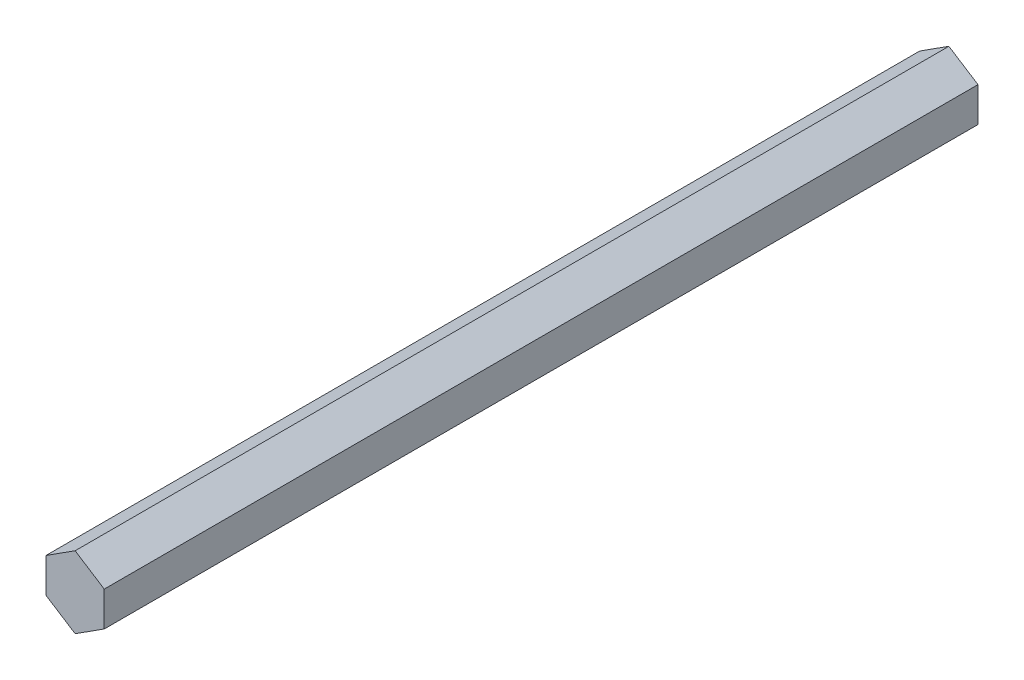
ISO-10303-21;
HEADER;
FILE_DESCRIPTION(('STEP AP214'),'2;1');
FILE_NAME('part.step','',(''),(''),'','','');
FILE_SCHEMA(('AUTOMOTIVE_DESIGN { 1 0 10303 214 1 1 1 1 }'));
ENDSEC;
DATA;
#1=APPLICATION_CONTEXT('core data for automotive mechanical design processes');
#2=APPLICATION_PROTOCOL_DEFINITION('international standard','automotive_design',2000,#1);
#3=PRODUCT_CONTEXT('',#1,'mechanical');
#4=PRODUCT('Part','Part','',(#3));
#5=PRODUCT_RELATED_PRODUCT_CATEGORY('part','',(#4));
#6=PRODUCT_DEFINITION_FORMATION('','',#4);
#7=PRODUCT_DEFINITION_CONTEXT('part definition',#1,'design');
#8=PRODUCT_DEFINITION('design','',#6,#7);
#9=PRODUCT_DEFINITION_SHAPE('','',#8);
#10=(LENGTH_UNIT() NAMED_UNIT(*) SI_UNIT(.MILLI.,.METRE.));
#11=(NAMED_UNIT(*) PLANE_ANGLE_UNIT() SI_UNIT($,.RADIAN.));
#12=(NAMED_UNIT(*) SI_UNIT($,.STERADIAN.) SOLID_ANGLE_UNIT());
#13=UNCERTAINTY_MEASURE_WITH_UNIT(LENGTH_MEASURE(1.E-05),#10,'distance_accuracy_value','');
#14=(GEOMETRIC_REPRESENTATION_CONTEXT(3) GLOBAL_UNCERTAINTY_ASSIGNED_CONTEXT((#13)) GLOBAL_UNIT_ASSIGNED_CONTEXT((#10,
#11,#12)) REPRESENTATION_CONTEXT('',''));
#15=CARTESIAN_POINT('',(0.,0.,0.));
#16=DIRECTION('',(0.,0.,1.));
#17=DIRECTION('',(1.,0.,0.));
#18=AXIS2_PLACEMENT_3D('',#15,#16,#17);
#19=CARTESIAN_POINT('',(-3.81,-2.43750099055179,114.3));
#20=DIRECTION('',(-0.538912681448957,0.842361633607262,0.));
#21=DIRECTION('',(-0.842361633607262,-0.538912681448957,0.));
#22=AXIS2_PLACEMENT_3D('',#19,#20,#21);
#23=PLANE('',#22);
#24=DIRECTION('',(0.842361633607262,0.538912681448957,0.));
#25=VECTOR('',#24,1.);
#26=CARTESIAN_POINT('',(-3.81,-2.43750099055179,0.));
#27=LINE('',#26,#25);
#28=CARTESIAN_POINT('',(-3.81,-2.43750099055179,0.));
#29=VERTEX_POINT('',#28);
#30=CARTESIAN_POINT('',(0.,0.,0.));
#31=VERTEX_POINT('',#30);
#32=EDGE_CURVE('E134',#29,#31,#27,.T.);
#33=ORIENTED_EDGE('',*,*,#32,.T.);
#34=DIRECTION('',(0.,0.,-1.));
#35=VECTOR('',#34,1.);
#36=CARTESIAN_POINT('',(0.,0.,114.3));
#37=LINE('',#36,#35);
#38=CARTESIAN_POINT('',(0.,0.,114.3));
#39=VERTEX_POINT('',#38);
#40=EDGE_CURVE('E11',#39,#31,#37,.T.);
#41=ORIENTED_EDGE('',*,*,#40,.F.);
#42=DIRECTION('',(0.842361633607262,0.538912681448957,0.));
#43=VECTOR('',#42,1.);
#44=CARTESIAN_POINT('',(-3.81,-2.43750099055179,114.3));
#45=LINE('',#44,#43);
#46=CARTESIAN_POINT('',(-3.81,-2.43750099055179,114.3));
#47=VERTEX_POINT('',#46);
#48=EDGE_CURVE('E150',#47,#39,#45,.T.);
#49=ORIENTED_EDGE('',*,*,#48,.F.);
#50=DIRECTION('',(0.,0.,-1.));
#51=VECTOR('',#50,1.);
#52=CARTESIAN_POINT('',(-3.81,-2.43750099055179,114.3));
#53=LINE('',#52,#51);
#54=EDGE_CURVE('E130',#47,#29,#53,.T.);
#55=ORIENTED_EDGE('',*,*,#54,.T.);
#56=EDGE_LOOP('',(#33,#41,#49,#55));
#57=FACE_BOUND('',#56,.T.);
#58=ADVANCED_FACE('F45',(#57),#23,.F.);
#59=CARTESIAN_POINT('',(0.,0.,114.3));
#60=DIRECTION('',(-1.,0.,0.));
#61=DIRECTION('',(0.,0.,1.));
#62=AXIS2_PLACEMENT_3D('',#59,#60,#61);
#63=PLANE('',#62);
#64=DIRECTION('',(0.,1.,0.));
#65=VECTOR('',#64,1.);
#66=CARTESIAN_POINT('',(0.,0.,0.));
#67=LINE('',#66,#65);
#68=CARTESIAN_POINT('',(0.,4.52299801889642,0.));
#69=VERTEX_POINT('',#68);
#70=EDGE_CURVE('E138',#31,#69,#67,.T.);
#71=ORIENTED_EDGE('',*,*,#70,.T.);
#72=DIRECTION('',(0.,0.,-1.));
#73=VECTOR('',#72,1.);
#74=CARTESIAN_POINT('',(0.,4.52299801889642,114.3));
#75=LINE('',#74,#73);
#76=CARTESIAN_POINT('',(0.,4.52299801889642,114.3));
#77=VERTEX_POINT('',#76);
#78=EDGE_CURVE('E54',#77,#69,#75,.T.);
#79=ORIENTED_EDGE('',*,*,#78,.F.);
#80=DIRECTION('',(0.,1.,0.));
#81=VECTOR('',#80,1.);
#82=CARTESIAN_POINT('',(0.,0.,114.3));
#83=LINE('',#82,#81);
#84=EDGE_CURVE('E99',#39,#77,#83,.T.);
#85=ORIENTED_EDGE('',*,*,#84,.F.);
#86=ORIENTED_EDGE('',*,*,#40,.T.);
#87=EDGE_LOOP('',(#71,#79,#85,#86));
#88=FACE_BOUND('',#87,.T.);
#89=ADVANCED_FACE('F178',(#88),#63,.F.);
#90=CARTESIAN_POINT('',(0.,4.52299801889642,114.3));
#91=DIRECTION('',(-0.538912681448957,-0.842361633607262,0.));
#92=DIRECTION('',(0.842361633607262,-0.538912681448957,0.));
#93=AXIS2_PLACEMENT_3D('',#90,#91,#92);
#94=PLANE('',#93);
#95=DIRECTION('',(-0.842361633607262,0.538912681448957,0.));
#96=VECTOR('',#95,1.);
#97=CARTESIAN_POINT('',(0.,4.52299801889642,0.));
#98=LINE('',#97,#96);
#99=CARTESIAN_POINT('',(-3.81,6.96049900944821,0.));
#100=VERTEX_POINT('',#99);
#101=EDGE_CURVE('E141',#69,#100,#98,.T.);
#102=ORIENTED_EDGE('',*,*,#101,.T.);
#103=DIRECTION('',(0.,0.,-1.));
#104=VECTOR('',#103,1.);
#105=CARTESIAN_POINT('',(-3.81,6.96049900944821,114.3));
#106=LINE('',#105,#104);
#107=CARTESIAN_POINT('',(-3.81,6.96049900944821,114.3));
#108=VERTEX_POINT('',#107);
#109=EDGE_CURVE('E123',#108,#100,#106,.T.);
#110=ORIENTED_EDGE('',*,*,#109,.F.);
#111=DIRECTION('',(-0.842361633607262,0.538912681448957,0.));
#112=VECTOR('',#111,1.);
#113=CARTESIAN_POINT('',(0.,4.52299801889642,114.3));
#114=LINE('',#113,#112);
#115=EDGE_CURVE('E112',#77,#108,#114,.T.);
#116=ORIENTED_EDGE('',*,*,#115,.F.);
#117=ORIENTED_EDGE('',*,*,#78,.T.);
#118=EDGE_LOOP('',(#102,#110,#116,#117));
#119=FACE_BOUND('',#118,.T.);
#120=ADVANCED_FACE('F160',(#119),#94,.F.);
#121=CARTESIAN_POINT('',(-3.81,6.96049900944821,114.3));
#122=DIRECTION('',(0.538912681448957,-0.842361633607262,0.));
#123=DIRECTION('',(0.842361633607262,0.538912681448957,0.));
#124=AXIS2_PLACEMENT_3D('',#121,#122,#123);
#125=PLANE('',#124);
#126=DIRECTION('',(-0.842361633607262,-0.538912681448957,0.));
#127=VECTOR('',#126,1.);
#128=CARTESIAN_POINT('',(-3.81,6.96049900944821,0.));
#129=LINE('',#128,#127);
#130=CARTESIAN_POINT('',(-7.62,4.52299801889642,0.));
#131=VERTEX_POINT('',#130);
#132=EDGE_CURVE('E121',#100,#131,#129,.T.);
#133=ORIENTED_EDGE('',*,*,#132,.T.);
#134=DIRECTION('',(0.,0.,-1.));
#135=VECTOR('',#134,1.);
#136=CARTESIAN_POINT('',(-7.62,4.52299801889642,114.3));
#137=LINE('',#136,#135);
#138=CARTESIAN_POINT('',(-7.62,4.52299801889642,114.3));
#139=VERTEX_POINT('',#138);
#140=EDGE_CURVE('E118',#139,#131,#137,.T.);
#141=ORIENTED_EDGE('',*,*,#140,.F.);
#142=DIRECTION('',(-0.842361633607262,-0.538912681448957,0.));
#143=VECTOR('',#142,1.);
#144=CARTESIAN_POINT('',(-3.81,6.96049900944821,114.3));
#145=LINE('',#144,#143);
#146=EDGE_CURVE('E106',#108,#139,#145,.T.);
#147=ORIENTED_EDGE('',*,*,#146,.F.);
#148=ORIENTED_EDGE('',*,*,#109,.T.);
#149=EDGE_LOOP('',(#133,#141,#147,#148));
#150=FACE_BOUND('',#149,.T.);
#151=ADVANCED_FACE('F119',(#150),#125,.F.);
#152=CARTESIAN_POINT('',(-7.62,4.52299801889642,114.3));
#153=DIRECTION('',(1.,0.,0.));
#154=DIRECTION('',(0.,1.,0.));
#155=AXIS2_PLACEMENT_3D('',#152,#153,#154);
#156=PLANE('',#155);
#157=DIRECTION('',(0.,-1.,0.));
#158=VECTOR('',#157,1.);
#159=CARTESIAN_POINT('',(-7.62,4.52299801889642,0.));
#160=LINE('',#159,#158);
#161=CARTESIAN_POINT('',(-7.62,0.,0.));
#162=VERTEX_POINT('',#161);
#163=EDGE_CURVE('E85',#131,#162,#160,.T.);
#164=ORIENTED_EDGE('',*,*,#163,.T.);
#165=DIRECTION('',(0.,0.,-1.));
#166=VECTOR('',#165,1.);
#167=CARTESIAN_POINT('',(-7.62,0.,114.3));
#168=LINE('',#167,#166);
#169=CARTESIAN_POINT('',(-7.62,0.,114.3));
#170=VERTEX_POINT('',#169);
#171=EDGE_CURVE('E124',#170,#162,#168,.T.);
#172=ORIENTED_EDGE('',*,*,#171,.F.);
#173=DIRECTION('',(0.,-1.,0.));
#174=VECTOR('',#173,1.);
#175=CARTESIAN_POINT('',(-7.62,4.52299801889642,114.3));
#176=LINE('',#175,#174);
#177=EDGE_CURVE('E110',#139,#170,#176,.T.);
#178=ORIENTED_EDGE('',*,*,#177,.F.);
#179=ORIENTED_EDGE('',*,*,#140,.T.);
#180=EDGE_LOOP('',(#164,#172,#178,#179));
#181=FACE_BOUND('',#180,.T.);
#182=ADVANCED_FACE('F126',(#181),#156,.F.);
#183=CARTESIAN_POINT('',(-7.62,0.,114.3));
#184=DIRECTION('',(0.538912681448957,0.842361633607262,0.));
#185=DIRECTION('',(-0.842361633607262,0.538912681448957,0.));
#186=AXIS2_PLACEMENT_3D('',#183,#184,#185);
#187=PLANE('',#186);
#188=DIRECTION('',(0.842361633607262,-0.538912681448957,0.));
#189=VECTOR('',#188,1.);
#190=CARTESIAN_POINT('',(-7.62,0.,0.));
#191=LINE('',#190,#189);
#192=EDGE_CURVE('E91',#162,#29,#191,.T.);
#193=ORIENTED_EDGE('',*,*,#192,.T.);
#194=ORIENTED_EDGE('',*,*,#54,.F.);
#195=DIRECTION('',(0.842361633607262,-0.538912681448957,0.));
#196=VECTOR('',#195,1.);
#197=CARTESIAN_POINT('',(-7.62,0.,114.3));
#198=LINE('',#197,#196);
#199=EDGE_CURVE('E62',#170,#47,#198,.T.);
#200=ORIENTED_EDGE('',*,*,#199,.F.);
#201=ORIENTED_EDGE('',*,*,#171,.T.);
#202=EDGE_LOOP('',(#193,#194,#200,#201));
#203=FACE_BOUND('',#202,.T.);
#204=ADVANCED_FACE('F167',(#203),#187,.F.);
#205=CARTESIAN_POINT('',(0.,0.,114.3));
#206=DIRECTION('',(0.,0.,1.));
#207=DIRECTION('',(1.,0.,0.));
#208=AXIS2_PLACEMENT_3D('',#205,#206,#207);
#209=PLANE('',#208);
#210=ORIENTED_EDGE('',*,*,#48,.T.);
#211=ORIENTED_EDGE('',*,*,#84,.T.);
#212=ORIENTED_EDGE('',*,*,#115,.T.);
#213=ORIENTED_EDGE('',*,*,#146,.T.);
#214=ORIENTED_EDGE('',*,*,#177,.T.);
#215=ORIENTED_EDGE('',*,*,#199,.T.);
#216=EDGE_LOOP('',(#210,#211,#212,#213,#214,#215));
#217=FACE_BOUND('',#216,.T.);
#218=ADVANCED_FACE('F108',(#217),#209,.T.);
#219=CARTESIAN_POINT('',(0.,0.,0.));
#220=DIRECTION('',(0.,0.,1.));
#221=DIRECTION('',(1.,0.,0.));
#222=AXIS2_PLACEMENT_3D('',#219,#220,#221);
#223=PLANE('',#222);
#224=ORIENTED_EDGE('',*,*,#32,.F.);
#225=ORIENTED_EDGE('',*,*,#192,.F.);
#226=ORIENTED_EDGE('',*,*,#163,.F.);
#227=ORIENTED_EDGE('',*,*,#132,.F.);
#228=ORIENTED_EDGE('',*,*,#101,.F.);
#229=ORIENTED_EDGE('',*,*,#70,.F.);
#230=EDGE_LOOP('',(#224,#225,#226,#227,#228,#229));
#231=FACE_BOUND('',#230,.T.);
#232=ADVANCED_FACE('F163',(#231),#223,.F.);
#233=CLOSED_SHELL('',(#58,#89,#120,#151,#182,#204,#218,#232));
#234=MANIFOLD_SOLID_BREP('B2',#233);
#235=ADVANCED_BREP_SHAPE_REPRESENTATION('',(#18,#234),#14);
#236=SHAPE_DEFINITION_REPRESENTATION(#9,#235);
ENDSEC;
END-ISO-10303-21;
